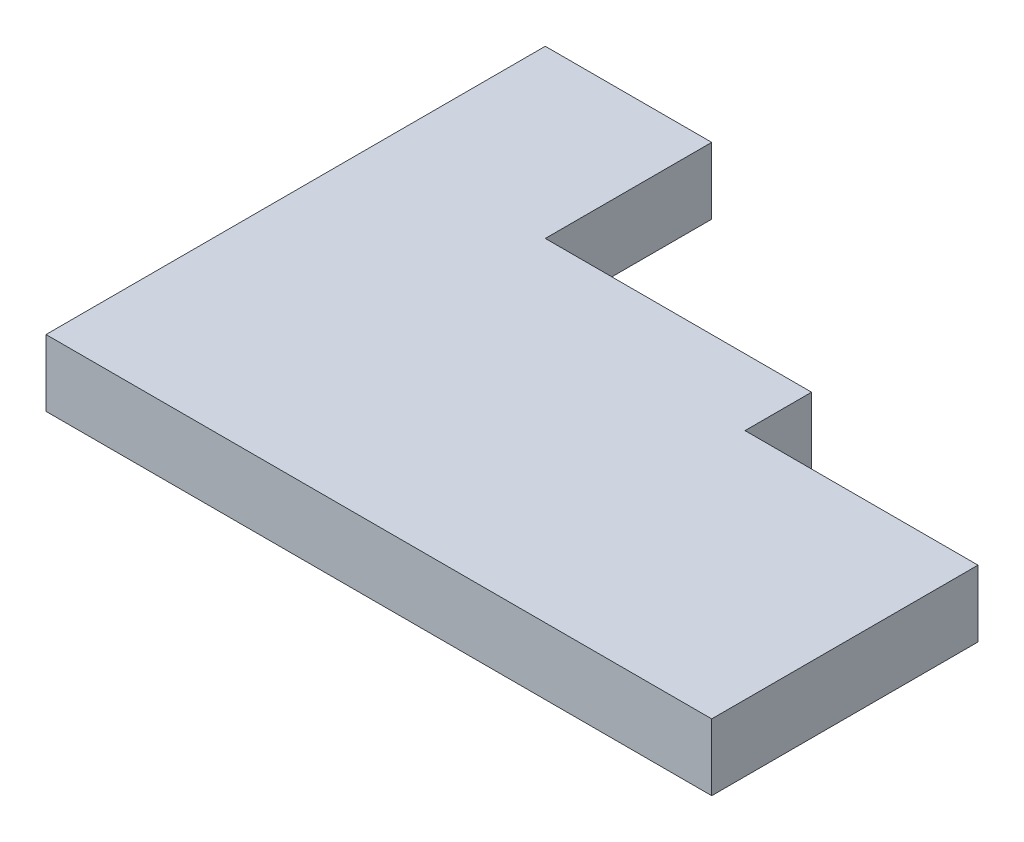
ISO-10303-21;
HEADER;
FILE_DESCRIPTION(('STEP AP214'),'2;1');
FILE_NAME('part.step','',(''),(''),'','','');
FILE_SCHEMA(('AUTOMOTIVE_DESIGN { 1 0 10303 214 1 1 1 1 }'));
ENDSEC;
DATA;
#1=APPLICATION_CONTEXT('core data for automotive mechanical design processes');
#2=APPLICATION_PROTOCOL_DEFINITION('international standard','automotive_design',2000,#1);
#3=PRODUCT_CONTEXT('',#1,'mechanical');
#4=PRODUCT('Part','Part','',(#3));
#5=PRODUCT_RELATED_PRODUCT_CATEGORY('part','',(#4));
#6=PRODUCT_DEFINITION_FORMATION('','',#4);
#7=PRODUCT_DEFINITION_CONTEXT('part definition',#1,'design');
#8=PRODUCT_DEFINITION('design','',#6,#7);
#9=PRODUCT_DEFINITION_SHAPE('','',#8);
#10=(LENGTH_UNIT() NAMED_UNIT(*) SI_UNIT(.MILLI.,.METRE.));
#11=(NAMED_UNIT(*) PLANE_ANGLE_UNIT() SI_UNIT($,.RADIAN.));
#12=(NAMED_UNIT(*) SI_UNIT($,.STERADIAN.) SOLID_ANGLE_UNIT());
#13=UNCERTAINTY_MEASURE_WITH_UNIT(LENGTH_MEASURE(1.E-05),#10,'distance_accuracy_value','');
#14=(GEOMETRIC_REPRESENTATION_CONTEXT(3) GLOBAL_UNCERTAINTY_ASSIGNED_CONTEXT((#13)) GLOBAL_UNIT_ASSIGNED_CONTEXT((#10,
#11,#12)) REPRESENTATION_CONTEXT('',''));
#15=CARTESIAN_POINT('',(0.,0.,0.));
#16=DIRECTION('',(0.,0.,1.));
#17=DIRECTION('',(1.,0.,0.));
#18=AXIS2_PLACEMENT_3D('',#15,#16,#17);
#19=CARTESIAN_POINT('',(0.,2.,0.));
#20=DIRECTION('',(0.,0.,-1.));
#21=DIRECTION('',(-1.,0.,0.));
#22=AXIS2_PLACEMENT_3D('',#19,#20,#21);
#23=PLANE('',#22);
#24=DIRECTION('',(1.,0.,0.));
#25=VECTOR('',#24,1.);
#26=CARTESIAN_POINT('',(0.,0.,0.));
#27=LINE('',#26,#25);
#28=CARTESIAN_POINT('',(0.,0.,0.));
#29=VERTEX_POINT('',#28);
#30=CARTESIAN_POINT('',(20.,0.,0.));
#31=VERTEX_POINT('',#30);
#32=EDGE_CURVE('E129',#29,#31,#27,.T.);
#33=ORIENTED_EDGE('',*,*,#32,.T.);
#34=DIRECTION('',(0.,-1.,0.));
#35=VECTOR('',#34,1.);
#36=CARTESIAN_POINT('',(20.,2.,0.));
#37=LINE('',#36,#35);
#38=CARTESIAN_POINT('',(20.,2.,0.));
#39=VERTEX_POINT('',#38);
#40=EDGE_CURVE('E11',#39,#31,#37,.T.);
#41=ORIENTED_EDGE('',*,*,#40,.F.);
#42=DIRECTION('',(1.,0.,0.));
#43=VECTOR('',#42,1.);
#44=CARTESIAN_POINT('',(0.,2.,0.));
#45=LINE('',#44,#43);
#46=CARTESIAN_POINT('',(0.,2.,0.));
#47=VERTEX_POINT('',#46);
#48=EDGE_CURVE('E149',#47,#39,#45,.T.);
#49=ORIENTED_EDGE('',*,*,#48,.F.);
#50=DIRECTION('',(0.,-1.,0.));
#51=VECTOR('',#50,1.);
#52=CARTESIAN_POINT('',(0.,2.,0.));
#53=LINE('',#52,#51);
#54=EDGE_CURVE('E48',#47,#29,#53,.T.);
#55=ORIENTED_EDGE('',*,*,#54,.T.);
#56=EDGE_LOOP('',(#33,#41,#49,#55));
#57=FACE_BOUND('',#56,.T.);
#58=ADVANCED_FACE('F32',(#57),#23,.F.);
#59=CARTESIAN_POINT('',(20.,2.,0.));
#60=DIRECTION('',(-1.,0.,0.));
#61=DIRECTION('',(0.,0.,1.));
#62=AXIS2_PLACEMENT_3D('',#59,#60,#61);
#63=PLANE('',#62);
#64=DIRECTION('',(0.,0.,-1.));
#65=VECTOR('',#64,1.);
#66=CARTESIAN_POINT('',(20.,0.,0.));
#67=LINE('',#66,#65);
#68=CARTESIAN_POINT('',(20.,0.,-8.));
#69=VERTEX_POINT('',#68);
#70=EDGE_CURVE('E131',#31,#69,#67,.T.);
#71=ORIENTED_EDGE('',*,*,#70,.T.);
#72=DIRECTION('',(0.,-1.,0.));
#73=VECTOR('',#72,1.);
#74=CARTESIAN_POINT('',(20.,2.,-8.));
#75=LINE('',#74,#73);
#76=CARTESIAN_POINT('',(20.,2.,-8.));
#77=VERTEX_POINT('',#76);
#78=EDGE_CURVE('E40',#77,#69,#75,.T.);
#79=ORIENTED_EDGE('',*,*,#78,.F.);
#80=DIRECTION('',(0.,0.,-1.));
#81=VECTOR('',#80,1.);
#82=CARTESIAN_POINT('',(20.,2.,0.));
#83=LINE('',#82,#81);
#84=EDGE_CURVE('E86',#39,#77,#83,.T.);
#85=ORIENTED_EDGE('',*,*,#84,.F.);
#86=ORIENTED_EDGE('',*,*,#40,.T.);
#87=EDGE_LOOP('',(#71,#79,#85,#86));
#88=FACE_BOUND('',#87,.T.);
#89=ADVANCED_FACE('F162',(#88),#63,.F.);
#90=CARTESIAN_POINT('',(13.,2.,-8.));
#91=DIRECTION('',(0.,0.,-1.));
#92=DIRECTION('',(-1.,0.,0.));
#93=AXIS2_PLACEMENT_3D('',#90,#91,#92);
#94=PLANE('',#93);
#95=DIRECTION('',(1.,0.,0.));
#96=VECTOR('',#95,1.);
#97=CARTESIAN_POINT('',(13.,0.,-8.));
#98=LINE('',#97,#96);
#99=CARTESIAN_POINT('',(13.,0.,-8.));
#100=VERTEX_POINT('',#99);
#101=EDGE_CURVE('E134',#100,#69,#98,.T.);
#102=ORIENTED_EDGE('',*,*,#101,.F.);
#103=DIRECTION('',(0.,-1.,0.));
#104=VECTOR('',#103,1.);
#105=CARTESIAN_POINT('',(13.,2.,-8.));
#106=LINE('',#105,#104);
#107=CARTESIAN_POINT('',(13.,2.,-8.));
#108=VERTEX_POINT('',#107);
#109=EDGE_CURVE('E155',#108,#100,#106,.T.);
#110=ORIENTED_EDGE('',*,*,#109,.F.);
#111=DIRECTION('',(1.,0.,0.));
#112=VECTOR('',#111,1.);
#113=CARTESIAN_POINT('',(13.,2.,-8.));
#114=LINE('',#113,#112);
#115=EDGE_CURVE('E161',#108,#77,#114,.T.);
#116=ORIENTED_EDGE('',*,*,#115,.T.);
#117=ORIENTED_EDGE('',*,*,#78,.T.);
#118=EDGE_LOOP('',(#102,#110,#116,#117));
#119=FACE_BOUND('',#118,.T.);
#120=ADVANCED_FACE('F159',(#119),#94,.T.);
#121=CARTESIAN_POINT('',(13.,2.,-10.));
#122=DIRECTION('',(1.,0.,0.));
#123=DIRECTION('',(0.,0.,-1.));
#124=AXIS2_PLACEMENT_3D('',#121,#122,#123);
#125=PLANE('',#124);
#126=DIRECTION('',(0.,0.,1.));
#127=VECTOR('',#126,1.);
#128=CARTESIAN_POINT('',(13.,0.,-10.));
#129=LINE('',#128,#127);
#130=CARTESIAN_POINT('',(13.,0.,-10.));
#131=VERTEX_POINT('',#130);
#132=EDGE_CURVE('E137',#131,#100,#129,.T.);
#133=ORIENTED_EDGE('',*,*,#132,.F.);
#134=DIRECTION('',(0.,-1.,0.));
#135=VECTOR('',#134,1.);
#136=CARTESIAN_POINT('',(13.,2.,-10.));
#137=LINE('',#136,#135);
#138=CARTESIAN_POINT('',(13.,2.,-10.));
#139=VERTEX_POINT('',#138);
#140=EDGE_CURVE('E153',#139,#131,#137,.T.);
#141=ORIENTED_EDGE('',*,*,#140,.F.);
#142=DIRECTION('',(0.,0.,1.));
#143=VECTOR('',#142,1.);
#144=CARTESIAN_POINT('',(13.,2.,-10.));
#145=LINE('',#144,#143);
#146=EDGE_CURVE('E171',#139,#108,#145,.T.);
#147=ORIENTED_EDGE('',*,*,#146,.T.);
#148=ORIENTED_EDGE('',*,*,#109,.T.);
#149=EDGE_LOOP('',(#133,#141,#147,#148));
#150=FACE_BOUND('',#149,.T.);
#151=ADVANCED_FACE('F169',(#150),#125,.T.);
#152=CARTESIAN_POINT('',(5.,2.,-10.));
#153=DIRECTION('',(0.,0.,-1.));
#154=DIRECTION('',(-1.,0.,0.));
#155=AXIS2_PLACEMENT_3D('',#152,#153,#154);
#156=PLANE('',#155);
#157=DIRECTION('',(1.,0.,0.));
#158=VECTOR('',#157,1.);
#159=CARTESIAN_POINT('',(5.,0.,-10.));
#160=LINE('',#159,#158);
#161=CARTESIAN_POINT('',(5.,0.,-10.));
#162=VERTEX_POINT('',#161);
#163=EDGE_CURVE('E140',#162,#131,#160,.T.);
#164=ORIENTED_EDGE('',*,*,#163,.F.);
#165=DIRECTION('',(0.,-1.,0.));
#166=VECTOR('',#165,1.);
#167=CARTESIAN_POINT('',(5.,2.,-10.));
#168=LINE('',#167,#166);
#169=CARTESIAN_POINT('',(5.,2.,-10.));
#170=VERTEX_POINT('',#169);
#171=EDGE_CURVE('E111',#170,#162,#168,.T.);
#172=ORIENTED_EDGE('',*,*,#171,.F.);
#173=DIRECTION('',(1.,0.,0.));
#174=VECTOR('',#173,1.);
#175=CARTESIAN_POINT('',(5.,2.,-10.));
#176=LINE('',#175,#174);
#177=EDGE_CURVE('E121',#170,#139,#176,.T.);
#178=ORIENTED_EDGE('',*,*,#177,.T.);
#179=ORIENTED_EDGE('',*,*,#140,.T.);
#180=EDGE_LOOP('',(#164,#172,#178,#179));
#181=FACE_BOUND('',#180,.T.);
#182=ADVANCED_FACE('F177',(#181),#156,.T.);
#183=CARTESIAN_POINT('',(5.,2.,-15.));
#184=DIRECTION('',(1.,0.,0.));
#185=DIRECTION('',(0.,0.,-1.));
#186=AXIS2_PLACEMENT_3D('',#183,#184,#185);
#187=PLANE('',#186);
#188=DIRECTION('',(0.,0.,1.));
#189=VECTOR('',#188,1.);
#190=CARTESIAN_POINT('',(5.,0.,-15.));
#191=LINE('',#190,#189);
#192=CARTESIAN_POINT('',(5.,0.,-15.));
#193=VERTEX_POINT('',#192);
#194=EDGE_CURVE('E107',#193,#162,#191,.T.);
#195=ORIENTED_EDGE('',*,*,#194,.F.);
#196=DIRECTION('',(0.,-1.,0.));
#197=VECTOR('',#196,1.);
#198=CARTESIAN_POINT('',(5.,2.,-15.));
#199=LINE('',#198,#197);
#200=CARTESIAN_POINT('',(5.,2.,-15.));
#201=VERTEX_POINT('',#200);
#202=EDGE_CURVE('E102',#201,#193,#199,.T.);
#203=ORIENTED_EDGE('',*,*,#202,.F.);
#204=DIRECTION('',(0.,0.,1.));
#205=VECTOR('',#204,1.);
#206=CARTESIAN_POINT('',(5.,2.,-15.));
#207=LINE('',#206,#205);
#208=EDGE_CURVE('E105',#201,#170,#207,.T.);
#209=ORIENTED_EDGE('',*,*,#208,.T.);
#210=ORIENTED_EDGE('',*,*,#171,.T.);
#211=EDGE_LOOP('',(#195,#203,#209,#210));
#212=FACE_BOUND('',#211,.T.);
#213=ADVANCED_FACE('F104',(#212),#187,.T.);
#214=CARTESIAN_POINT('',(0.,2.,-15.));
#215=DIRECTION('',(0.,0.,-1.));
#216=DIRECTION('',(-1.,0.,0.));
#217=AXIS2_PLACEMENT_3D('',#214,#215,#216);
#218=PLANE('',#217);
#219=DIRECTION('',(1.,0.,0.));
#220=VECTOR('',#219,1.);
#221=CARTESIAN_POINT('',(0.,0.,-15.));
#222=LINE('',#221,#220);
#223=CARTESIAN_POINT('',(0.,0.,-15.));
#224=VERTEX_POINT('',#223);
#225=EDGE_CURVE('E144',#224,#193,#222,.T.);
#226=ORIENTED_EDGE('',*,*,#225,.F.);
#227=DIRECTION('',(0.,-1.,0.));
#228=VECTOR('',#227,1.);
#229=CARTESIAN_POINT('',(0.,2.,-15.));
#230=LINE('',#229,#228);
#231=CARTESIAN_POINT('',(0.,2.,-15.));
#232=VERTEX_POINT('',#231);
#233=EDGE_CURVE('E74',#232,#224,#230,.T.);
#234=ORIENTED_EDGE('',*,*,#233,.F.);
#235=DIRECTION('',(1.,0.,0.));
#236=VECTOR('',#235,1.);
#237=CARTESIAN_POINT('',(0.,2.,-15.));
#238=LINE('',#237,#236);
#239=EDGE_CURVE('E118',#232,#201,#238,.T.);
#240=ORIENTED_EDGE('',*,*,#239,.T.);
#241=ORIENTED_EDGE('',*,*,#202,.T.);
#242=EDGE_LOOP('',(#226,#234,#240,#241));
#243=FACE_BOUND('',#242,.T.);
#244=ADVANCED_FACE('F123',(#243),#218,.T.);
#245=CARTESIAN_POINT('',(0.,2.,0.));
#246=DIRECTION('',(-1.,0.,0.));
#247=DIRECTION('',(0.,0.,1.));
#248=AXIS2_PLACEMENT_3D('',#245,#246,#247);
#249=PLANE('',#248);
#250=DIRECTION('',(0.,0.,-1.));
#251=VECTOR('',#250,1.);
#252=CARTESIAN_POINT('',(0.,0.,0.));
#253=LINE('',#252,#251);
#254=EDGE_CURVE('E146',#29,#224,#253,.T.);
#255=ORIENTED_EDGE('',*,*,#254,.F.);
#256=ORIENTED_EDGE('',*,*,#54,.F.);
#257=DIRECTION('',(0.,0.,-1.));
#258=VECTOR('',#257,1.);
#259=CARTESIAN_POINT('',(0.,2.,0.));
#260=LINE('',#259,#258);
#261=EDGE_CURVE('E124',#47,#232,#260,.T.);
#262=ORIENTED_EDGE('',*,*,#261,.T.);
#263=ORIENTED_EDGE('',*,*,#233,.T.);
#264=EDGE_LOOP('',(#255,#256,#262,#263));
#265=FACE_BOUND('',#264,.T.);
#266=ADVANCED_FACE('F178',(#265),#249,.T.);
#267=CARTESIAN_POINT('',(0.,2.,0.));
#268=DIRECTION('',(0.,1.,0.));
#269=DIRECTION('',(0.,0.,1.));
#270=AXIS2_PLACEMENT_3D('',#267,#268,#269);
#271=PLANE('',#270);
#272=ORIENTED_EDGE('',*,*,#48,.T.);
#273=ORIENTED_EDGE('',*,*,#84,.T.);
#274=ORIENTED_EDGE('',*,*,#115,.F.);
#275=ORIENTED_EDGE('',*,*,#146,.F.);
#276=ORIENTED_EDGE('',*,*,#177,.F.);
#277=ORIENTED_EDGE('',*,*,#208,.F.);
#278=ORIENTED_EDGE('',*,*,#239,.F.);
#279=ORIENTED_EDGE('',*,*,#261,.F.);
#280=EDGE_LOOP('',(#272,#273,#274,#275,#276,#277,#278,#279));
#281=FACE_BOUND('',#280,.T.);
#282=ADVANCED_FACE('F116',(#281),#271,.T.);
#283=CARTESIAN_POINT('',(0.,0.,0.));
#284=DIRECTION('',(0.,1.,0.));
#285=DIRECTION('',(0.,0.,1.));
#286=AXIS2_PLACEMENT_3D('',#283,#284,#285);
#287=PLANE('',#286);
#288=ORIENTED_EDGE('',*,*,#32,.F.);
#289=ORIENTED_EDGE('',*,*,#254,.T.);
#290=ORIENTED_EDGE('',*,*,#225,.T.);
#291=ORIENTED_EDGE('',*,*,#194,.T.);
#292=ORIENTED_EDGE('',*,*,#163,.T.);
#293=ORIENTED_EDGE('',*,*,#132,.T.);
#294=ORIENTED_EDGE('',*,*,#101,.T.);
#295=ORIENTED_EDGE('',*,*,#70,.F.);
#296=EDGE_LOOP('',(#288,#289,#290,#291,#292,#293,#294,#295));
#297=FACE_BOUND('',#296,.T.);
#298=ADVANCED_FACE('F165',(#297),#287,.F.);
#299=CLOSED_SHELL('',(#58,#89,#120,#151,#182,#213,#244,#266,#282,#298));
#300=MANIFOLD_SOLID_BREP('B2',#299);
#301=ADVANCED_BREP_SHAPE_REPRESENTATION('',(#18,#300),#14);
#302=SHAPE_DEFINITION_REPRESENTATION(#9,#301);
ENDSEC;
END-ISO-10303-21;
